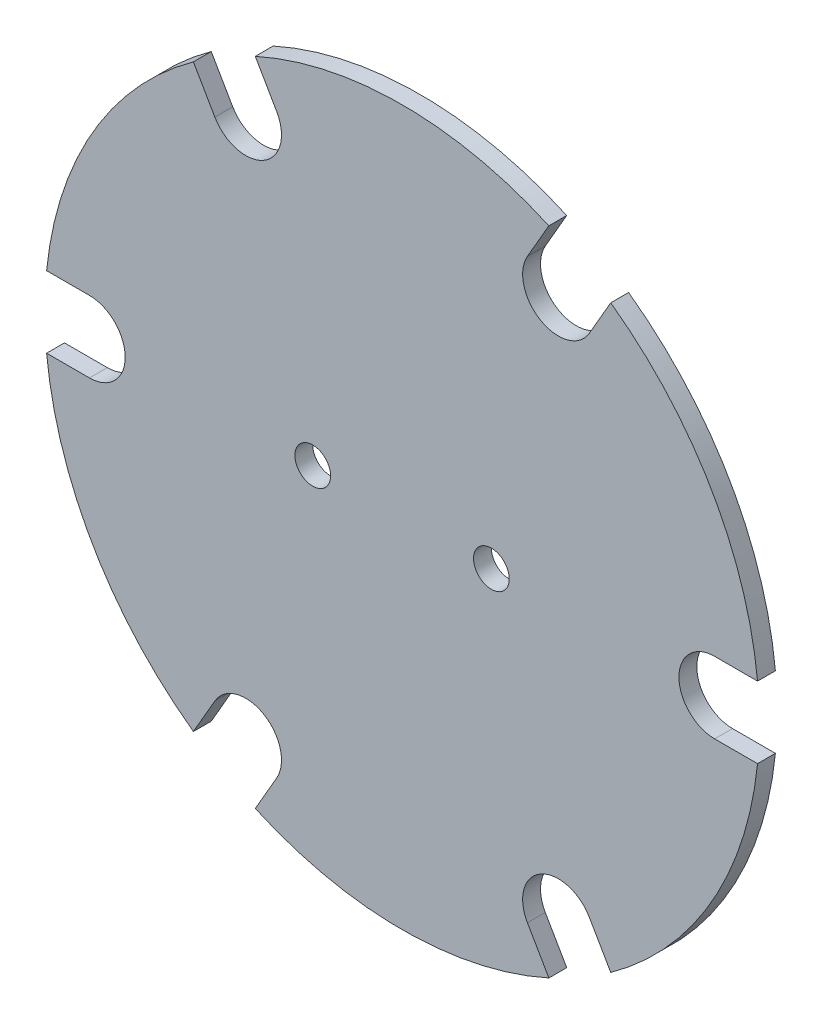
ISO-10303-21;
HEADER;
FILE_DESCRIPTION(('STEP AP214'),'2;1');
FILE_NAME('part.step','',(''),(''),'','','');
FILE_SCHEMA(('AUTOMOTIVE_DESIGN { 1 0 10303 214 1 1 1 1 }'));
ENDSEC;
DATA;
#1=APPLICATION_CONTEXT('core data for automotive mechanical design processes');
#2=APPLICATION_PROTOCOL_DEFINITION('international standard','automotive_design',2000,#1);
#3=PRODUCT_CONTEXT('',#1,'mechanical');
#4=PRODUCT('Part','Part','',(#3));
#5=PRODUCT_RELATED_PRODUCT_CATEGORY('part','',(#4));
#6=PRODUCT_DEFINITION_FORMATION('','',#4);
#7=PRODUCT_DEFINITION_CONTEXT('part definition',#1,'design');
#8=PRODUCT_DEFINITION('design','',#6,#7);
#9=PRODUCT_DEFINITION_SHAPE('','',#8);
#10=(LENGTH_UNIT() NAMED_UNIT(*) SI_UNIT(.MILLI.,.METRE.));
#11=(NAMED_UNIT(*) PLANE_ANGLE_UNIT() SI_UNIT($,.RADIAN.));
#12=(NAMED_UNIT(*) SI_UNIT($,.STERADIAN.) SOLID_ANGLE_UNIT());
#13=UNCERTAINTY_MEASURE_WITH_UNIT(LENGTH_MEASURE(1.E-05),#10,'distance_accuracy_value','');
#14=(GEOMETRIC_REPRESENTATION_CONTEXT(3) GLOBAL_UNCERTAINTY_ASSIGNED_CONTEXT((#13)) GLOBAL_UNIT_ASSIGNED_CONTEXT((#10,
#11,#12)) REPRESENTATION_CONTEXT('',''));
#15=CARTESIAN_POINT('',(0.,0.,0.));
#16=DIRECTION('',(0.,0.,1.));
#17=DIRECTION('',(1.,0.,0.));
#18=AXIS2_PLACEMENT_3D('',#15,#16,#17);
#19=CARTESIAN_POINT('',(-35.,0.,2.));
#20=DIRECTION('',(0.,0.,1.));
#21=DIRECTION('',(1.,0.,0.));
#22=AXIS2_PLACEMENT_3D('',#19,#20,#21);
#23=PLANE('',#22);
#24=CARTESIAN_POINT('',(-10.,0.,2.));
#25=DIRECTION('',(0.,0.,1.));
#26=DIRECTION('',(1.,0.,0.));
#27=AXIS2_PLACEMENT_3D('',#24,#25,#26);
#28=CIRCLE('',#27,2.);
#29=CARTESIAN_POINT('',(-8.,0.,2.));
#30=VERTEX_POINT('',#29);
#31=EDGE_CURVE('E230',#30,#30,#28,.T.);
#32=ORIENTED_EDGE('',*,*,#31,.F.);
#33=EDGE_LOOP('',(#32));
#34=FACE_BOUND('',#33,.T.);
#35=CARTESIAN_POINT('',(-35.,0.,2.));
#36=DIRECTION('',(0.,0.,-1.));
#37=DIRECTION('',(1.,0.,0.));
#38=AXIS2_PLACEMENT_3D('',#35,#36,#37);
#39=CIRCLE('',#38,4.);
#40=CARTESIAN_POINT('',(-35.,4.,2.));
#41=VERTEX_POINT('',#40);
#42=CARTESIAN_POINT('',(-35.,-4.,2.));
#43=VERTEX_POINT('',#42);
#44=EDGE_CURVE('E273',#41,#43,#39,.T.);
#45=ORIENTED_EDGE('',*,*,#44,.T.);
#46=DIRECTION('',(-1.,0.,0.));
#47=VECTOR('',#46,1.);
#48=CARTESIAN_POINT('',(-35.,-4.,2.));
#49=LINE('',#48,#47);
#50=CARTESIAN_POINT('',(-39.7994974842648,-3.99999999999999,2.));
#51=VERTEX_POINT('',#50);
#52=EDGE_CURVE('E141',#43,#51,#49,.T.);
#53=ORIENTED_EDGE('',*,*,#52,.T.);
#54=CARTESIAN_POINT('',(0.,0.,2.));
#55=DIRECTION('',(0.,0.,1.));
#56=DIRECTION('',(1.,0.,0.));
#57=AXIS2_PLACEMENT_3D('',#54,#55,#56);
#58=CIRCLE('',#57,40.);
#59=CARTESIAN_POINT('',(-23.3638503572701,-32.4673758792282,2.));
#60=VERTEX_POINT('',#59);
#61=EDGE_CURVE('E336',#51,#60,#58,.T.);
#62=ORIENTED_EDGE('',*,*,#61,.T.);
#63=DIRECTION('',(0.500000000000002,0.866025403784437,0.));
#64=VECTOR('',#63,1.);
#65=CARTESIAN_POINT('',(-20.9641016151377,-28.3108891324554,2.));
#66=LINE('',#65,#64);
#67=CARTESIAN_POINT('',(-20.9641016151377,-28.3108891324554,2.));
#68=VERTEX_POINT('',#67);
#69=EDGE_CURVE('E355',#60,#68,#66,.T.);
#70=ORIENTED_EDGE('',*,*,#69,.T.);
#71=CARTESIAN_POINT('',(-17.5,-30.3108891324554,2.));
#72=DIRECTION('',(0.,0.,-1.));
#73=DIRECTION('',(1.,0.,0.));
#74=AXIS2_PLACEMENT_3D('',#71,#72,#73);
#75=CIRCLE('',#74,4.);
#76=CARTESIAN_POINT('',(-14.0358983848622,-32.3108891324554,2.));
#77=VERTEX_POINT('',#76);
#78=EDGE_CURVE('E352',#68,#77,#75,.T.);
#79=ORIENTED_EDGE('',*,*,#78,.T.);
#80=DIRECTION('',(-0.499999999999999,-0.866025403784439,0.));
#81=VECTOR('',#80,1.);
#82=CARTESIAN_POINT('',(-14.0358983848622,-32.3108891324554,2.));
#83=LINE('',#82,#81);
#84=CARTESIAN_POINT('',(-16.4356471269946,-36.4673758792282,2.));
#85=VERTEX_POINT('',#84);
#86=EDGE_CURVE('E354',#77,#85,#83,.T.);
#87=ORIENTED_EDGE('',*,*,#86,.T.);
#88=CARTESIAN_POINT('',(0.,0.,2.));
#89=DIRECTION('',(0.,0.,1.));
#90=DIRECTION('',(1.,0.,0.));
#91=AXIS2_PLACEMENT_3D('',#88,#89,#90);
#92=CIRCLE('',#91,40.);
#93=CARTESIAN_POINT('',(16.4356471269947,-36.4673758792282,2.));
#94=VERTEX_POINT('',#93);
#95=EDGE_CURVE('E357',#85,#94,#92,.T.);
#96=ORIENTED_EDGE('',*,*,#95,.T.);
#97=DIRECTION('',(-0.499999999999999,0.866025403784439,0.));
#98=VECTOR('',#97,1.);
#99=CARTESIAN_POINT('',(14.0358983848623,-32.3108891324554,2.));
#100=LINE('',#99,#98);
#101=CARTESIAN_POINT('',(14.0358983848623,-32.3108891324554,2.));
#102=VERTEX_POINT('',#101);
#103=EDGE_CURVE('E363',#94,#102,#100,.T.);
#104=ORIENTED_EDGE('',*,*,#103,.T.);
#105=CARTESIAN_POINT('',(17.5,-30.3108891324554,2.));
#106=DIRECTION('',(0.,0.,-1.));
#107=DIRECTION('',(1.,0.,0.));
#108=AXIS2_PLACEMENT_3D('',#105,#106,#107);
#109=CIRCLE('',#108,4.);
#110=CARTESIAN_POINT('',(20.9641016151378,-28.3108891324553,2.));
#111=VERTEX_POINT('',#110);
#112=EDGE_CURVE('E365',#102,#111,#109,.T.);
#113=ORIENTED_EDGE('',*,*,#112,.T.);
#114=DIRECTION('',(0.5,-0.866025403784439,0.));
#115=VECTOR('',#114,1.);
#116=CARTESIAN_POINT('',(20.9641016151378,-28.3108891324553,2.));
#117=LINE('',#116,#115);
#118=CARTESIAN_POINT('',(23.3638503572702,-32.4673758792282,2.));
#119=VERTEX_POINT('',#118);
#120=EDGE_CURVE('E367',#111,#119,#117,.T.);
#121=ORIENTED_EDGE('',*,*,#120,.T.);
#122=CARTESIAN_POINT('',(0.,0.,2.));
#123=DIRECTION('',(0.,0.,1.));
#124=DIRECTION('',(1.,0.,0.));
#125=AXIS2_PLACEMENT_3D('',#122,#123,#124);
#126=CIRCLE('',#125,40.);
#127=CARTESIAN_POINT('',(39.7994974842648,-4.,2.));
#128=VERTEX_POINT('',#127);
#129=EDGE_CURVE('E369',#119,#128,#126,.T.);
#130=ORIENTED_EDGE('',*,*,#129,.T.);
#131=DIRECTION('',(-1.,0.,0.));
#132=VECTOR('',#131,1.);
#133=CARTESIAN_POINT('',(35.,-4.,2.));
#134=LINE('',#133,#132);
#135=CARTESIAN_POINT('',(35.,-4.,2.));
#136=VERTEX_POINT('',#135);
#137=EDGE_CURVE('E371',#128,#136,#134,.T.);
#138=ORIENTED_EDGE('',*,*,#137,.T.);
#139=CARTESIAN_POINT('',(35.,0.,2.));
#140=DIRECTION('',(0.,0.,-1.));
#141=DIRECTION('',(1.,0.,0.));
#142=AXIS2_PLACEMENT_3D('',#139,#140,#141);
#143=CIRCLE('',#142,4.);
#144=CARTESIAN_POINT('',(35.,4.,2.));
#145=VERTEX_POINT('',#144);
#146=EDGE_CURVE('E373',#136,#145,#143,.T.);
#147=ORIENTED_EDGE('',*,*,#146,.T.);
#148=DIRECTION('',(1.,0.,0.));
#149=VECTOR('',#148,1.);
#150=CARTESIAN_POINT('',(35.,4.,2.));
#151=LINE('',#150,#149);
#152=CARTESIAN_POINT('',(39.7994974842648,4.00000000000001,2.));
#153=VERTEX_POINT('',#152);
#154=EDGE_CURVE('E375',#145,#153,#151,.T.);
#155=ORIENTED_EDGE('',*,*,#154,.T.);
#156=CARTESIAN_POINT('',(0.,0.,2.));
#157=DIRECTION('',(0.,0.,1.));
#158=DIRECTION('',(1.,0.,0.));
#159=AXIS2_PLACEMENT_3D('',#156,#157,#158);
#160=CIRCLE('',#159,40.);
#161=CARTESIAN_POINT('',(23.3638503572701,32.4673758792282,2.));
#162=VERTEX_POINT('',#161);
#163=EDGE_CURVE('E377',#153,#162,#160,.T.);
#164=ORIENTED_EDGE('',*,*,#163,.T.);
#165=DIRECTION('',(-0.5,-0.866025403784439,0.));
#166=VECTOR('',#165,1.);
#167=CARTESIAN_POINT('',(20.9641016151378,28.3108891324554,2.));
#168=LINE('',#167,#166);
#169=CARTESIAN_POINT('',(20.9641016151378,28.3108891324554,2.));
#170=VERTEX_POINT('',#169);
#171=EDGE_CURVE('E379',#162,#170,#168,.T.);
#172=ORIENTED_EDGE('',*,*,#171,.T.);
#173=CARTESIAN_POINT('',(17.5,30.3108891324554,2.));
#174=DIRECTION('',(0.,0.,-1.));
#175=DIRECTION('',(1.,0.,0.));
#176=AXIS2_PLACEMENT_3D('',#173,#174,#175);
#177=CIRCLE('',#176,4.);
#178=CARTESIAN_POINT('',(14.0358983848622,32.3108891324554,2.));
#179=VERTEX_POINT('',#178);
#180=EDGE_CURVE('E381',#170,#179,#177,.T.);
#181=ORIENTED_EDGE('',*,*,#180,.T.);
#182=DIRECTION('',(0.499999999999999,0.866025403784439,0.));
#183=VECTOR('',#182,1.);
#184=CARTESIAN_POINT('',(14.0358983848622,32.3108891324554,2.));
#185=LINE('',#184,#183);
#186=CARTESIAN_POINT('',(16.4356471269946,36.4673758792282,2.));
#187=VERTEX_POINT('',#186);
#188=EDGE_CURVE('E383',#179,#187,#185,.T.);
#189=ORIENTED_EDGE('',*,*,#188,.T.);
#190=CARTESIAN_POINT('',(0.,0.,2.));
#191=DIRECTION('',(0.,0.,1.));
#192=DIRECTION('',(1.,0.,0.));
#193=AXIS2_PLACEMENT_3D('',#190,#191,#192);
#194=CIRCLE('',#193,40.);
#195=CARTESIAN_POINT('',(-16.4356471269946,36.4673758792282,2.));
#196=VERTEX_POINT('',#195);
#197=EDGE_CURVE('E385',#187,#196,#194,.T.);
#198=ORIENTED_EDGE('',*,*,#197,.T.);
#199=DIRECTION('',(0.5,-0.866025403784439,0.));
#200=VECTOR('',#199,1.);
#201=CARTESIAN_POINT('',(-14.0358983848623,32.3108891324554,2.));
#202=LINE('',#201,#200);
#203=CARTESIAN_POINT('',(-14.0358983848623,32.3108891324554,2.));
#204=VERTEX_POINT('',#203);
#205=EDGE_CURVE('E387',#196,#204,#202,.T.);
#206=ORIENTED_EDGE('',*,*,#205,.T.);
#207=CARTESIAN_POINT('',(-17.5,30.3108891324554,2.));
#208=DIRECTION('',(0.,0.,-1.));
#209=DIRECTION('',(1.,0.,0.));
#210=AXIS2_PLACEMENT_3D('',#207,#208,#209);
#211=CIRCLE('',#210,4.);
#212=CARTESIAN_POINT('',(-20.9641016151378,28.3108891324554,2.));
#213=VERTEX_POINT('',#212);
#214=EDGE_CURVE('E208',#204,#213,#211,.T.);
#215=ORIENTED_EDGE('',*,*,#214,.T.);
#216=DIRECTION('',(-0.5,0.866025403784438,0.));
#217=VECTOR('',#216,1.);
#218=CARTESIAN_POINT('',(-20.9641016151378,28.3108891324554,2.));
#219=LINE('',#218,#217);
#220=CARTESIAN_POINT('',(-23.3638503572702,32.4673758792282,2.));
#221=VERTEX_POINT('',#220);
#222=EDGE_CURVE('E202',#213,#221,#219,.T.);
#223=ORIENTED_EDGE('',*,*,#222,.T.);
#224=CARTESIAN_POINT('',(0.,0.,2.));
#225=DIRECTION('',(0.,0.,1.));
#226=DIRECTION('',(1.,0.,0.));
#227=AXIS2_PLACEMENT_3D('',#224,#225,#226);
#228=CIRCLE('',#227,40.);
#229=CARTESIAN_POINT('',(-39.7994974842648,4.,2.));
#230=VERTEX_POINT('',#229);
#231=EDGE_CURVE('E206',#221,#230,#228,.T.);
#232=ORIENTED_EDGE('',*,*,#231,.T.);
#233=DIRECTION('',(1.,0.,0.));
#234=VECTOR('',#233,1.);
#235=CARTESIAN_POINT('',(-35.,4.,2.));
#236=LINE('',#235,#234);
#237=EDGE_CURVE('E50',#230,#41,#236,.T.);
#238=ORIENTED_EDGE('',*,*,#237,.T.);
#239=EDGE_LOOP('',(#45,#53,#62,#70,#79,#87,#96,#104,#113,#121,#130,#138,#147,#155,#164,#172,
#181,#189,#198,#206,#215,#223,#232,#238));
#240=FACE_BOUND('',#239,.T.);
#241=CARTESIAN_POINT('',(10.,0.,2.));
#242=DIRECTION('',(0.,0.,1.));
#243=DIRECTION('',(1.,0.,0.));
#244=AXIS2_PLACEMENT_3D('',#241,#242,#243);
#245=CIRCLE('',#244,2.);
#246=CARTESIAN_POINT('',(12.,0.,2.));
#247=VERTEX_POINT('',#246);
#248=EDGE_CURVE('E429',#247,#247,#245,.T.);
#249=ORIENTED_EDGE('',*,*,#248,.F.);
#250=EDGE_LOOP('',(#249));
#251=FACE_BOUND('',#250,.T.);
#252=ADVANCED_FACE('F33',(#34,#240,#251),#23,.T.);
#253=CARTESIAN_POINT('',(-35.,0.,0.));
#254=DIRECTION('',(0.,0.,1.));
#255=DIRECTION('',(1.,0.,0.));
#256=AXIS2_PLACEMENT_3D('',#253,#254,#255);
#257=PLANE('',#256);
#258=CARTESIAN_POINT('',(-35.,0.,0.));
#259=DIRECTION('',(0.,0.,-1.));
#260=DIRECTION('',(1.,0.,0.));
#261=AXIS2_PLACEMENT_3D('',#258,#259,#260);
#262=CIRCLE('',#261,4.);
#263=CARTESIAN_POINT('',(-35.,4.,0.));
#264=VERTEX_POINT('',#263);
#265=CARTESIAN_POINT('',(-35.,-4.,0.));
#266=VERTEX_POINT('',#265);
#267=EDGE_CURVE('E226',#264,#266,#262,.T.);
#268=ORIENTED_EDGE('',*,*,#267,.F.);
#269=DIRECTION('',(1.,0.,0.));
#270=VECTOR('',#269,1.);
#271=CARTESIAN_POINT('',(-35.,4.,0.));
#272=LINE('',#271,#270);
#273=CARTESIAN_POINT('',(-39.7994974842648,4.,0.));
#274=VERTEX_POINT('',#273);
#275=EDGE_CURVE('E133',#274,#264,#272,.T.);
#276=ORIENTED_EDGE('',*,*,#275,.F.);
#277=CARTESIAN_POINT('',(0.,0.,0.));
#278=DIRECTION('',(0.,0.,1.));
#279=DIRECTION('',(1.,0.,0.));
#280=AXIS2_PLACEMENT_3D('',#277,#278,#279);
#281=CIRCLE('',#280,40.);
#282=CARTESIAN_POINT('',(-23.3638503572702,32.4673758792282,0.));
#283=VERTEX_POINT('',#282);
#284=EDGE_CURVE('E127',#283,#274,#281,.T.);
#285=ORIENTED_EDGE('',*,*,#284,.F.);
#286=DIRECTION('',(-0.5,0.866025403784438,0.));
#287=VECTOR('',#286,1.);
#288=CARTESIAN_POINT('',(-20.9641016151378,28.3108891324554,0.));
#289=LINE('',#288,#287);
#290=CARTESIAN_POINT('',(-20.9641016151378,28.3108891324554,0.));
#291=VERTEX_POINT('',#290);
#292=EDGE_CURVE('E216',#291,#283,#289,.T.);
#293=ORIENTED_EDGE('',*,*,#292,.F.);
#294=CARTESIAN_POINT('',(-17.5,30.3108891324554,0.));
#295=DIRECTION('',(0.,0.,-1.));
#296=DIRECTION('',(1.,0.,0.));
#297=AXIS2_PLACEMENT_3D('',#294,#295,#296);
#298=CIRCLE('',#297,4.);
#299=CARTESIAN_POINT('',(-14.0358983848623,32.3108891324554,0.));
#300=VERTEX_POINT('',#299);
#301=EDGE_CURVE('E268',#300,#291,#298,.T.);
#302=ORIENTED_EDGE('',*,*,#301,.F.);
#303=DIRECTION('',(0.5,-0.866025403784439,0.));
#304=VECTOR('',#303,1.);
#305=CARTESIAN_POINT('',(-14.0358983848623,32.3108891324554,0.));
#306=LINE('',#305,#304);
#307=CARTESIAN_POINT('',(-16.4356471269946,36.4673758792282,0.));
#308=VERTEX_POINT('',#307);
#309=EDGE_CURVE('E266',#308,#300,#306,.T.);
#310=ORIENTED_EDGE('',*,*,#309,.F.);
#311=CARTESIAN_POINT('',(0.,0.,0.));
#312=DIRECTION('',(0.,0.,1.));
#313=DIRECTION('',(1.,0.,0.));
#314=AXIS2_PLACEMENT_3D('',#311,#312,#313);
#315=CIRCLE('',#314,40.);
#316=CARTESIAN_POINT('',(16.4356471269946,36.4673758792282,0.));
#317=VERTEX_POINT('',#316);
#318=EDGE_CURVE('E264',#317,#308,#315,.T.);
#319=ORIENTED_EDGE('',*,*,#318,.F.);
#320=DIRECTION('',(0.499999999999999,0.866025403784439,0.));
#321=VECTOR('',#320,1.);
#322=CARTESIAN_POINT('',(14.0358983848622,32.3108891324554,0.));
#323=LINE('',#322,#321);
#324=CARTESIAN_POINT('',(14.0358983848622,32.3108891324554,0.));
#325=VERTEX_POINT('',#324);
#326=EDGE_CURVE('E262',#325,#317,#323,.T.);
#327=ORIENTED_EDGE('',*,*,#326,.F.);
#328=CARTESIAN_POINT('',(17.5,30.3108891324554,0.));
#329=DIRECTION('',(0.,0.,-1.));
#330=DIRECTION('',(1.,0.,0.));
#331=AXIS2_PLACEMENT_3D('',#328,#329,#330);
#332=CIRCLE('',#331,4.);
#333=CARTESIAN_POINT('',(20.9641016151378,28.3108891324554,0.));
#334=VERTEX_POINT('',#333);
#335=EDGE_CURVE('E260',#334,#325,#332,.T.);
#336=ORIENTED_EDGE('',*,*,#335,.F.);
#337=DIRECTION('',(-0.5,-0.866025403784439,0.));
#338=VECTOR('',#337,1.);
#339=CARTESIAN_POINT('',(20.9641016151378,28.3108891324554,0.));
#340=LINE('',#339,#338);
#341=CARTESIAN_POINT('',(23.3638503572701,32.4673758792282,0.));
#342=VERTEX_POINT('',#341);
#343=EDGE_CURVE('E258',#342,#334,#340,.T.);
#344=ORIENTED_EDGE('',*,*,#343,.F.);
#345=CARTESIAN_POINT('',(0.,0.,0.));
#346=DIRECTION('',(0.,0.,1.));
#347=DIRECTION('',(1.,0.,0.));
#348=AXIS2_PLACEMENT_3D('',#345,#346,#347);
#349=CIRCLE('',#348,40.);
#350=CARTESIAN_POINT('',(39.7994974842648,4.00000000000001,0.));
#351=VERTEX_POINT('',#350);
#352=EDGE_CURVE('E256',#351,#342,#349,.T.);
#353=ORIENTED_EDGE('',*,*,#352,.F.);
#354=DIRECTION('',(1.,0.,0.));
#355=VECTOR('',#354,1.);
#356=CARTESIAN_POINT('',(35.,4.,0.));
#357=LINE('',#356,#355);
#358=CARTESIAN_POINT('',(35.,4.,0.));
#359=VERTEX_POINT('',#358);
#360=EDGE_CURVE('E254',#359,#351,#357,.T.);
#361=ORIENTED_EDGE('',*,*,#360,.F.);
#362=CARTESIAN_POINT('',(35.,0.,0.));
#363=DIRECTION('',(0.,0.,-1.));
#364=DIRECTION('',(1.,0.,0.));
#365=AXIS2_PLACEMENT_3D('',#362,#363,#364);
#366=CIRCLE('',#365,4.);
#367=CARTESIAN_POINT('',(35.,-4.,0.));
#368=VERTEX_POINT('',#367);
#369=EDGE_CURVE('E252',#368,#359,#366,.T.);
#370=ORIENTED_EDGE('',*,*,#369,.F.);
#371=DIRECTION('',(-1.,0.,0.));
#372=VECTOR('',#371,1.);
#373=CARTESIAN_POINT('',(35.,-4.,0.));
#374=LINE('',#373,#372);
#375=CARTESIAN_POINT('',(39.7994974842648,-4.,0.));
#376=VERTEX_POINT('',#375);
#377=EDGE_CURVE('E250',#376,#368,#374,.T.);
#378=ORIENTED_EDGE('',*,*,#377,.F.);
#379=CARTESIAN_POINT('',(0.,0.,0.));
#380=DIRECTION('',(0.,0.,1.));
#381=DIRECTION('',(1.,0.,0.));
#382=AXIS2_PLACEMENT_3D('',#379,#380,#381);
#383=CIRCLE('',#382,40.);
#384=CARTESIAN_POINT('',(23.3638503572702,-32.4673758792282,0.));
#385=VERTEX_POINT('',#384);
#386=EDGE_CURVE('E248',#385,#376,#383,.T.);
#387=ORIENTED_EDGE('',*,*,#386,.F.);
#388=DIRECTION('',(0.5,-0.866025403784439,0.));
#389=VECTOR('',#388,1.);
#390=CARTESIAN_POINT('',(20.9641016151378,-28.3108891324553,0.));
#391=LINE('',#390,#389);
#392=CARTESIAN_POINT('',(20.9641016151378,-28.3108891324553,0.));
#393=VERTEX_POINT('',#392);
#394=EDGE_CURVE('E246',#393,#385,#391,.T.);
#395=ORIENTED_EDGE('',*,*,#394,.F.);
#396=CARTESIAN_POINT('',(17.5,-30.3108891324554,0.));
#397=DIRECTION('',(0.,0.,-1.));
#398=DIRECTION('',(1.,0.,0.));
#399=AXIS2_PLACEMENT_3D('',#396,#397,#398);
#400=CIRCLE('',#399,4.);
#401=CARTESIAN_POINT('',(14.0358983848623,-32.3108891324554,0.));
#402=VERTEX_POINT('',#401);
#403=EDGE_CURVE('E244',#402,#393,#400,.T.);
#404=ORIENTED_EDGE('',*,*,#403,.F.);
#405=DIRECTION('',(-0.499999999999999,0.866025403784439,0.));
#406=VECTOR('',#405,1.);
#407=CARTESIAN_POINT('',(14.0358983848623,-32.3108891324554,0.));
#408=LINE('',#407,#406);
#409=CARTESIAN_POINT('',(16.4356471269947,-36.4673758792282,0.));
#410=VERTEX_POINT('',#409);
#411=EDGE_CURVE('E242',#410,#402,#408,.T.);
#412=ORIENTED_EDGE('',*,*,#411,.F.);
#413=CARTESIAN_POINT('',(0.,0.,0.));
#414=DIRECTION('',(0.,0.,1.));
#415=DIRECTION('',(1.,0.,0.));
#416=AXIS2_PLACEMENT_3D('',#413,#414,#415);
#417=CIRCLE('',#416,40.);
#418=CARTESIAN_POINT('',(-16.4356471269946,-36.4673758792282,0.));
#419=VERTEX_POINT('',#418);
#420=EDGE_CURVE('E240',#419,#410,#417,.T.);
#421=ORIENTED_EDGE('',*,*,#420,.F.);
#422=DIRECTION('',(-0.499999999999999,-0.866025403784439,0.));
#423=VECTOR('',#422,1.);
#424=CARTESIAN_POINT('',(-14.0358983848622,-32.3108891324554,0.));
#425=LINE('',#424,#423);
#426=CARTESIAN_POINT('',(-14.0358983848622,-32.3108891324554,0.));
#427=VERTEX_POINT('',#426);
#428=EDGE_CURVE('E238',#427,#419,#425,.T.);
#429=ORIENTED_EDGE('',*,*,#428,.F.);
#430=CARTESIAN_POINT('',(-17.5,-30.3108891324554,0.));
#431=DIRECTION('',(0.,0.,-1.));
#432=DIRECTION('',(1.,0.,0.));
#433=AXIS2_PLACEMENT_3D('',#430,#431,#432);
#434=CIRCLE('',#433,4.);
#435=CARTESIAN_POINT('',(-20.9641016151377,-28.3108891324554,0.));
#436=VERTEX_POINT('',#435);
#437=EDGE_CURVE('E236',#436,#427,#434,.T.);
#438=ORIENTED_EDGE('',*,*,#437,.F.);
#439=DIRECTION('',(0.500000000000002,0.866025403784437,0.));
#440=VECTOR('',#439,1.);
#441=CARTESIAN_POINT('',(-20.9641016151377,-28.3108891324554,0.));
#442=LINE('',#441,#440);
#443=CARTESIAN_POINT('',(-23.3638503572701,-32.4673758792282,0.));
#444=VERTEX_POINT('',#443);
#445=EDGE_CURVE('E234',#444,#436,#442,.T.);
#446=ORIENTED_EDGE('',*,*,#445,.F.);
#447=CARTESIAN_POINT('',(0.,0.,0.));
#448=DIRECTION('',(0.,0.,1.));
#449=DIRECTION('',(1.,0.,0.));
#450=AXIS2_PLACEMENT_3D('',#447,#448,#449);
#451=CIRCLE('',#450,40.);
#452=CARTESIAN_POINT('',(-39.7994974842648,-3.99999999999999,0.));
#453=VERTEX_POINT('',#452);
#454=EDGE_CURVE('E232',#453,#444,#451,.T.);
#455=ORIENTED_EDGE('',*,*,#454,.F.);
#456=DIRECTION('',(-1.,0.,0.));
#457=VECTOR('',#456,1.);
#458=CARTESIAN_POINT('',(-35.,-4.,0.));
#459=LINE('',#458,#457);
#460=EDGE_CURVE('E229',#266,#453,#459,.T.);
#461=ORIENTED_EDGE('',*,*,#460,.F.);
#462=EDGE_LOOP('',(#268,#276,#285,#293,#302,#310,#319,#327,#336,#344,#353,#361,#370,#378,#387,
#395,#404,#412,#421,#429,#438,#446,#455,#461));
#463=FACE_BOUND('',#462,.T.);
#464=CARTESIAN_POINT('',(-10.,0.,0.));
#465=DIRECTION('',(0.,0.,1.));
#466=DIRECTION('',(1.,0.,0.));
#467=AXIS2_PLACEMENT_3D('',#464,#465,#466);
#468=CIRCLE('',#467,2.);
#469=CARTESIAN_POINT('',(-8.,0.,0.));
#470=VERTEX_POINT('',#469);
#471=EDGE_CURVE('E435',#470,#470,#468,.T.);
#472=ORIENTED_EDGE('',*,*,#471,.T.);
#473=EDGE_LOOP('',(#472));
#474=FACE_BOUND('',#473,.T.);
#475=CARTESIAN_POINT('',(10.,0.,0.));
#476=DIRECTION('',(0.,0.,1.));
#477=DIRECTION('',(1.,0.,0.));
#478=AXIS2_PLACEMENT_3D('',#475,#476,#477);
#479=CIRCLE('',#478,2.);
#480=CARTESIAN_POINT('',(12.,0.,0.));
#481=VERTEX_POINT('',#480);
#482=EDGE_CURVE('E432',#481,#481,#479,.T.);
#483=ORIENTED_EDGE('',*,*,#482,.T.);
#484=EDGE_LOOP('',(#483));
#485=FACE_BOUND('',#484,.T.);
#486=ADVANCED_FACE('F340',(#463,#474,#485),#257,.F.);
#487=CARTESIAN_POINT('',(-35.,0.,2.));
#488=DIRECTION('',(0.,0.,-1.));
#489=DIRECTION('',(-1.,0.,0.));
#490=AXIS2_PLACEMENT_3D('',#487,#488,#489);
#491=CYLINDRICAL_SURFACE('',#490,4.);
#492=ORIENTED_EDGE('',*,*,#267,.T.);
#493=DIRECTION('',(0.,0.,-1.));
#494=VECTOR('',#493,1.);
#495=CARTESIAN_POINT('',(-35.,-4.,2.));
#496=LINE('',#495,#494);
#497=EDGE_CURVE('E11',#43,#266,#496,.T.);
#498=ORIENTED_EDGE('',*,*,#497,.F.);
#499=ORIENTED_EDGE('',*,*,#44,.F.);
#500=DIRECTION('',(0.,0.,-1.));
#501=VECTOR('',#500,1.);
#502=CARTESIAN_POINT('',(-35.,4.,2.));
#503=LINE('',#502,#501);
#504=EDGE_CURVE('E222',#41,#264,#503,.T.);
#505=ORIENTED_EDGE('',*,*,#504,.T.);
#506=EDGE_LOOP('',(#492,#498,#499,#505));
#507=FACE_BOUND('',#506,.T.);
#508=ADVANCED_FACE('F35',(#507),#491,.F.);
#509=CARTESIAN_POINT('',(-35.,-4.,2.));
#510=DIRECTION('',(0.,-1.,0.));
#511=DIRECTION('',(0.,0.,-1.));
#512=AXIS2_PLACEMENT_3D('',#509,#510,#511);
#513=PLANE('',#512);
#514=ORIENTED_EDGE('',*,*,#460,.T.);
#515=DIRECTION('',(0.,0.,-1.));
#516=VECTOR('',#515,1.);
#517=CARTESIAN_POINT('',(-39.7994974842648,-3.99999999999999,2.));
#518=LINE('',#517,#516);
#519=EDGE_CURVE('E42',#51,#453,#518,.T.);
#520=ORIENTED_EDGE('',*,*,#519,.F.);
#521=ORIENTED_EDGE('',*,*,#52,.F.);
#522=ORIENTED_EDGE('',*,*,#497,.T.);
#523=EDGE_LOOP('',(#514,#520,#521,#522));
#524=FACE_BOUND('',#523,.T.);
#525=ADVANCED_FACE('F648',(#524),#513,.F.);
#526=CARTESIAN_POINT('',(0.,0.,2.));
#527=DIRECTION('',(0.,0.,-1.));
#528=DIRECTION('',(-1.,0.,0.));
#529=AXIS2_PLACEMENT_3D('',#526,#527,#528);
#530=CYLINDRICAL_SURFACE('',#529,40.);
#531=ORIENTED_EDGE('',*,*,#454,.T.);
#532=DIRECTION('',(0.,0.,-1.));
#533=VECTOR('',#532,1.);
#534=CARTESIAN_POINT('',(-23.3638503572701,-32.4673758792282,2.));
#535=LINE('',#534,#533);
#536=EDGE_CURVE('E328',#60,#444,#535,.T.);
#537=ORIENTED_EDGE('',*,*,#536,.F.);
#538=ORIENTED_EDGE('',*,*,#61,.F.);
#539=ORIENTED_EDGE('',*,*,#519,.T.);
#540=EDGE_LOOP('',(#531,#537,#538,#539));
#541=FACE_BOUND('',#540,.T.);
#542=ADVANCED_FACE('F334',(#541),#530,.T.);
#543=CARTESIAN_POINT('',(-20.9641016151377,-28.3108891324554,2.));
#544=DIRECTION('',(-0.866025403784437,0.500000000000002,0.));
#545=DIRECTION('',(-0.500000000000002,-0.866025403784437,0.));
#546=AXIS2_PLACEMENT_3D('',#543,#544,#545);
#547=PLANE('',#546);
#548=ORIENTED_EDGE('',*,*,#445,.T.);
#549=DIRECTION('',(0.,0.,-1.));
#550=VECTOR('',#549,1.);
#551=CARTESIAN_POINT('',(-20.9641016151377,-28.3108891324554,2.));
#552=LINE('',#551,#550);
#553=EDGE_CURVE('E325',#68,#436,#552,.T.);
#554=ORIENTED_EDGE('',*,*,#553,.F.);
#555=ORIENTED_EDGE('',*,*,#69,.F.);
#556=ORIENTED_EDGE('',*,*,#536,.T.);
#557=EDGE_LOOP('',(#548,#554,#555,#556));
#558=FACE_BOUND('',#557,.T.);
#559=ADVANCED_FACE('F346',(#558),#547,.F.);
#560=CARTESIAN_POINT('',(-17.5,-30.3108891324554,2.));
#561=DIRECTION('',(0.,0.,-1.));
#562=DIRECTION('',(-1.,0.,0.));
#563=AXIS2_PLACEMENT_3D('',#560,#561,#562);
#564=CYLINDRICAL_SURFACE('',#563,4.);
#565=ORIENTED_EDGE('',*,*,#437,.T.);
#566=DIRECTION('',(0.,0.,-1.));
#567=VECTOR('',#566,1.);
#568=CARTESIAN_POINT('',(-14.0358983848622,-32.3108891324554,2.));
#569=LINE('',#568,#567);
#570=EDGE_CURVE('E322',#77,#427,#569,.T.);
#571=ORIENTED_EDGE('',*,*,#570,.F.);
#572=ORIENTED_EDGE('',*,*,#78,.F.);
#573=ORIENTED_EDGE('',*,*,#553,.T.);
#574=EDGE_LOOP('',(#565,#571,#572,#573));
#575=FACE_BOUND('',#574,.T.);
#576=ADVANCED_FACE('F350',(#575),#564,.F.);
#577=CARTESIAN_POINT('',(-14.0358983848622,-32.3108891324554,2.));
#578=DIRECTION('',(0.866025403784439,-0.499999999999999,0.));
#579=DIRECTION('',(0.499999999999999,0.866025403784439,0.));
#580=AXIS2_PLACEMENT_3D('',#577,#578,#579);
#581=PLANE('',#580);
#582=ORIENTED_EDGE('',*,*,#428,.T.);
#583=DIRECTION('',(0.,0.,-1.));
#584=VECTOR('',#583,1.);
#585=CARTESIAN_POINT('',(-16.4356471269946,-36.4673758792282,2.));
#586=LINE('',#585,#584);
#587=EDGE_CURVE('E319',#85,#419,#586,.T.);
#588=ORIENTED_EDGE('',*,*,#587,.F.);
#589=ORIENTED_EDGE('',*,*,#86,.F.);
#590=ORIENTED_EDGE('',*,*,#570,.T.);
#591=EDGE_LOOP('',(#582,#588,#589,#590));
#592=FACE_BOUND('',#591,.T.);
#593=ADVANCED_FACE('F613',(#592),#581,.F.);
#594=CARTESIAN_POINT('',(0.,0.,2.));
#595=DIRECTION('',(0.,0.,-1.));
#596=DIRECTION('',(-1.,0.,0.));
#597=AXIS2_PLACEMENT_3D('',#594,#595,#596);
#598=CYLINDRICAL_SURFACE('',#597,40.);
#599=ORIENTED_EDGE('',*,*,#420,.T.);
#600=DIRECTION('',(0.,0.,-1.));
#601=VECTOR('',#600,1.);
#602=CARTESIAN_POINT('',(16.4356471269947,-36.4673758792282,2.));
#603=LINE('',#602,#601);
#604=EDGE_CURVE('E316',#94,#410,#603,.T.);
#605=ORIENTED_EDGE('',*,*,#604,.F.);
#606=ORIENTED_EDGE('',*,*,#95,.F.);
#607=ORIENTED_EDGE('',*,*,#587,.T.);
#608=EDGE_LOOP('',(#599,#605,#606,#607));
#609=FACE_BOUND('',#608,.T.);
#610=ADVANCED_FACE('F603',(#609),#598,.T.);
#611=CARTESIAN_POINT('',(14.0358983848623,-32.3108891324554,2.));
#612=DIRECTION('',(-0.866025403784439,-0.499999999999999,0.));
#613=DIRECTION('',(0.499999999999999,-0.866025403784439,0.));
#614=AXIS2_PLACEMENT_3D('',#611,#612,#613);
#615=PLANE('',#614);
#616=ORIENTED_EDGE('',*,*,#411,.T.);
#617=DIRECTION('',(0.,0.,-1.));
#618=VECTOR('',#617,1.);
#619=CARTESIAN_POINT('',(14.0358983848623,-32.3108891324554,2.));
#620=LINE('',#619,#618);
#621=EDGE_CURVE('E313',#102,#402,#620,.T.);
#622=ORIENTED_EDGE('',*,*,#621,.F.);
#623=ORIENTED_EDGE('',*,*,#103,.F.);
#624=ORIENTED_EDGE('',*,*,#604,.T.);
#625=EDGE_LOOP('',(#616,#622,#623,#624));
#626=FACE_BOUND('',#625,.T.);
#627=ADVANCED_FACE('F593',(#626),#615,.F.);
#628=CARTESIAN_POINT('',(17.5,-30.3108891324554,2.));
#629=DIRECTION('',(0.,0.,-1.));
#630=DIRECTION('',(-1.,0.,0.));
#631=AXIS2_PLACEMENT_3D('',#628,#629,#630);
#632=CYLINDRICAL_SURFACE('',#631,4.);
#633=ORIENTED_EDGE('',*,*,#403,.T.);
#634=DIRECTION('',(0.,0.,-1.));
#635=VECTOR('',#634,1.);
#636=CARTESIAN_POINT('',(20.9641016151378,-28.3108891324553,2.));
#637=LINE('',#636,#635);
#638=EDGE_CURVE('E310',#111,#393,#637,.T.);
#639=ORIENTED_EDGE('',*,*,#638,.F.);
#640=ORIENTED_EDGE('',*,*,#112,.F.);
#641=ORIENTED_EDGE('',*,*,#621,.T.);
#642=EDGE_LOOP('',(#633,#639,#640,#641));
#643=FACE_BOUND('',#642,.T.);
#644=ADVANCED_FACE('F583',(#643),#632,.F.);
#645=CARTESIAN_POINT('',(20.9641016151378,-28.3108891324553,2.));
#646=DIRECTION('',(0.866025403784439,0.5,0.));
#647=DIRECTION('',(-0.5,0.866025403784439,0.));
#648=AXIS2_PLACEMENT_3D('',#645,#646,#647);
#649=PLANE('',#648);
#650=ORIENTED_EDGE('',*,*,#394,.T.);
#651=DIRECTION('',(0.,0.,-1.));
#652=VECTOR('',#651,1.);
#653=CARTESIAN_POINT('',(23.3638503572702,-32.4673758792282,2.));
#654=LINE('',#653,#652);
#655=EDGE_CURVE('E307',#119,#385,#654,.T.);
#656=ORIENTED_EDGE('',*,*,#655,.F.);
#657=ORIENTED_EDGE('',*,*,#120,.F.);
#658=ORIENTED_EDGE('',*,*,#638,.T.);
#659=EDGE_LOOP('',(#650,#656,#657,#658));
#660=FACE_BOUND('',#659,.T.);
#661=ADVANCED_FACE('F573',(#660),#649,.F.);
#662=CARTESIAN_POINT('',(0.,0.,2.));
#663=DIRECTION('',(0.,0.,-1.));
#664=DIRECTION('',(-1.,0.,0.));
#665=AXIS2_PLACEMENT_3D('',#662,#663,#664);
#666=CYLINDRICAL_SURFACE('',#665,40.);
#667=ORIENTED_EDGE('',*,*,#386,.T.);
#668=DIRECTION('',(0.,0.,-1.));
#669=VECTOR('',#668,1.);
#670=CARTESIAN_POINT('',(39.7994974842648,-4.,2.));
#671=LINE('',#670,#669);
#672=EDGE_CURVE('E304',#128,#376,#671,.T.);
#673=ORIENTED_EDGE('',*,*,#672,.F.);
#674=ORIENTED_EDGE('',*,*,#129,.F.);
#675=ORIENTED_EDGE('',*,*,#655,.T.);
#676=EDGE_LOOP('',(#667,#673,#674,#675));
#677=FACE_BOUND('',#676,.T.);
#678=ADVANCED_FACE('F563',(#677),#666,.T.);
#679=CARTESIAN_POINT('',(35.,-4.,2.));
#680=DIRECTION('',(0.,-1.,0.));
#681=DIRECTION('',(0.,0.,-1.));
#682=AXIS2_PLACEMENT_3D('',#679,#680,#681);
#683=PLANE('',#682);
#684=ORIENTED_EDGE('',*,*,#377,.T.);
#685=DIRECTION('',(0.,0.,-1.));
#686=VECTOR('',#685,1.);
#687=CARTESIAN_POINT('',(35.,-4.,2.));
#688=LINE('',#687,#686);
#689=EDGE_CURVE('E301',#136,#368,#688,.T.);
#690=ORIENTED_EDGE('',*,*,#689,.F.);
#691=ORIENTED_EDGE('',*,*,#137,.F.);
#692=ORIENTED_EDGE('',*,*,#672,.T.);
#693=EDGE_LOOP('',(#684,#690,#691,#692));
#694=FACE_BOUND('',#693,.T.);
#695=ADVANCED_FACE('F553',(#694),#683,.F.);
#696=CARTESIAN_POINT('',(35.,0.,2.));
#697=DIRECTION('',(0.,0.,-1.));
#698=DIRECTION('',(-1.,0.,0.));
#699=AXIS2_PLACEMENT_3D('',#696,#697,#698);
#700=CYLINDRICAL_SURFACE('',#699,4.);
#701=ORIENTED_EDGE('',*,*,#369,.T.);
#702=DIRECTION('',(0.,0.,-1.));
#703=VECTOR('',#702,1.);
#704=CARTESIAN_POINT('',(35.,4.,2.));
#705=LINE('',#704,#703);
#706=EDGE_CURVE('E298',#145,#359,#705,.T.);
#707=ORIENTED_EDGE('',*,*,#706,.F.);
#708=ORIENTED_EDGE('',*,*,#146,.F.);
#709=ORIENTED_EDGE('',*,*,#689,.T.);
#710=EDGE_LOOP('',(#701,#707,#708,#709));
#711=FACE_BOUND('',#710,.T.);
#712=ADVANCED_FACE('F543',(#711),#700,.F.);
#713=CARTESIAN_POINT('',(35.,4.,2.));
#714=DIRECTION('',(0.,1.,0.));
#715=DIRECTION('',(-1.,0.,0.));
#716=AXIS2_PLACEMENT_3D('',#713,#714,#715);
#717=PLANE('',#716);
#718=ORIENTED_EDGE('',*,*,#360,.T.);
#719=DIRECTION('',(0.,0.,-1.));
#720=VECTOR('',#719,1.);
#721=CARTESIAN_POINT('',(39.7994974842648,4.00000000000001,2.));
#722=LINE('',#721,#720);
#723=EDGE_CURVE('E295',#153,#351,#722,.T.);
#724=ORIENTED_EDGE('',*,*,#723,.F.);
#725=ORIENTED_EDGE('',*,*,#154,.F.);
#726=ORIENTED_EDGE('',*,*,#706,.T.);
#727=EDGE_LOOP('',(#718,#724,#725,#726));
#728=FACE_BOUND('',#727,.T.);
#729=ADVANCED_FACE('F533',(#728),#717,.F.);
#730=CARTESIAN_POINT('',(0.,0.,2.));
#731=DIRECTION('',(0.,0.,-1.));
#732=DIRECTION('',(-1.,0.,0.));
#733=AXIS2_PLACEMENT_3D('',#730,#731,#732);
#734=CYLINDRICAL_SURFACE('',#733,40.);
#735=ORIENTED_EDGE('',*,*,#352,.T.);
#736=DIRECTION('',(0.,0.,-1.));
#737=VECTOR('',#736,1.);
#738=CARTESIAN_POINT('',(23.3638503572701,32.4673758792282,2.));
#739=LINE('',#738,#737);
#740=EDGE_CURVE('E292',#162,#342,#739,.T.);
#741=ORIENTED_EDGE('',*,*,#740,.F.);
#742=ORIENTED_EDGE('',*,*,#163,.F.);
#743=ORIENTED_EDGE('',*,*,#723,.T.);
#744=EDGE_LOOP('',(#735,#741,#742,#743));
#745=FACE_BOUND('',#744,.T.);
#746=ADVANCED_FACE('F523',(#745),#734,.T.);
#747=CARTESIAN_POINT('',(20.9641016151378,28.3108891324554,2.));
#748=DIRECTION('',(0.866025403784439,-0.499999999999999,0.));
#749=DIRECTION('',(0.5,0.866025403784439,0.));
#750=AXIS2_PLACEMENT_3D('',#747,#748,#749);
#751=PLANE('',#750);
#752=ORIENTED_EDGE('',*,*,#343,.T.);
#753=DIRECTION('',(0.,0.,-1.));
#754=VECTOR('',#753,1.);
#755=CARTESIAN_POINT('',(20.9641016151378,28.3108891324554,2.));
#756=LINE('',#755,#754);
#757=EDGE_CURVE('E289',#170,#334,#756,.T.);
#758=ORIENTED_EDGE('',*,*,#757,.F.);
#759=ORIENTED_EDGE('',*,*,#171,.F.);
#760=ORIENTED_EDGE('',*,*,#740,.T.);
#761=EDGE_LOOP('',(#752,#758,#759,#760));
#762=FACE_BOUND('',#761,.T.);
#763=ADVANCED_FACE('F513',(#762),#751,.F.);
#764=CARTESIAN_POINT('',(17.5,30.3108891324554,2.));
#765=DIRECTION('',(0.,0.,-1.));
#766=DIRECTION('',(-1.,0.,0.));
#767=AXIS2_PLACEMENT_3D('',#764,#765,#766);
#768=CYLINDRICAL_SURFACE('',#767,4.);
#769=ORIENTED_EDGE('',*,*,#335,.T.);
#770=DIRECTION('',(0.,0.,-1.));
#771=VECTOR('',#770,1.);
#772=CARTESIAN_POINT('',(14.0358983848622,32.3108891324554,2.));
#773=LINE('',#772,#771);
#774=EDGE_CURVE('E286',#179,#325,#773,.T.);
#775=ORIENTED_EDGE('',*,*,#774,.F.);
#776=ORIENTED_EDGE('',*,*,#180,.F.);
#777=ORIENTED_EDGE('',*,*,#757,.T.);
#778=EDGE_LOOP('',(#769,#775,#776,#777));
#779=FACE_BOUND('',#778,.T.);
#780=ADVANCED_FACE('F503',(#779),#768,.F.);
#781=CARTESIAN_POINT('',(14.0358983848622,32.3108891324554,2.));
#782=DIRECTION('',(-0.866025403784439,0.499999999999999,0.));
#783=DIRECTION('',(-0.499999999999999,-0.866025403784439,0.));
#784=AXIS2_PLACEMENT_3D('',#781,#782,#783);
#785=PLANE('',#784);
#786=ORIENTED_EDGE('',*,*,#326,.T.);
#787=DIRECTION('',(0.,0.,-1.));
#788=VECTOR('',#787,1.);
#789=CARTESIAN_POINT('',(16.4356471269946,36.4673758792282,2.));
#790=LINE('',#789,#788);
#791=EDGE_CURVE('E283',#187,#317,#790,.T.);
#792=ORIENTED_EDGE('',*,*,#791,.F.);
#793=ORIENTED_EDGE('',*,*,#188,.F.);
#794=ORIENTED_EDGE('',*,*,#774,.T.);
#795=EDGE_LOOP('',(#786,#792,#793,#794));
#796=FACE_BOUND('',#795,.T.);
#797=ADVANCED_FACE('F493',(#796),#785,.F.);
#798=CARTESIAN_POINT('',(0.,0.,2.));
#799=DIRECTION('',(0.,0.,-1.));
#800=DIRECTION('',(-1.,0.,0.));
#801=AXIS2_PLACEMENT_3D('',#798,#799,#800);
#802=CYLINDRICAL_SURFACE('',#801,40.);
#803=ORIENTED_EDGE('',*,*,#318,.T.);
#804=DIRECTION('',(0.,0.,-1.));
#805=VECTOR('',#804,1.);
#806=CARTESIAN_POINT('',(-16.4356471269946,36.4673758792282,2.));
#807=LINE('',#806,#805);
#808=EDGE_CURVE('E280',#196,#308,#807,.T.);
#809=ORIENTED_EDGE('',*,*,#808,.F.);
#810=ORIENTED_EDGE('',*,*,#197,.F.);
#811=ORIENTED_EDGE('',*,*,#791,.T.);
#812=EDGE_LOOP('',(#803,#809,#810,#811));
#813=FACE_BOUND('',#812,.T.);
#814=ADVANCED_FACE('F484',(#813),#802,.T.);
#815=CARTESIAN_POINT('',(-14.0358983848623,32.3108891324554,2.));
#816=DIRECTION('',(0.866025403784439,0.5,0.));
#817=DIRECTION('',(-0.5,0.866025403784439,0.));
#818=AXIS2_PLACEMENT_3D('',#815,#816,#817);
#819=PLANE('',#818);
#820=ORIENTED_EDGE('',*,*,#309,.T.);
#821=DIRECTION('',(0.,0.,-1.));
#822=VECTOR('',#821,1.);
#823=CARTESIAN_POINT('',(-14.0358983848623,32.3108891324554,2.));
#824=LINE('',#823,#822);
#825=EDGE_CURVE('E277',#204,#300,#824,.T.);
#826=ORIENTED_EDGE('',*,*,#825,.F.);
#827=ORIENTED_EDGE('',*,*,#205,.F.);
#828=ORIENTED_EDGE('',*,*,#808,.T.);
#829=EDGE_LOOP('',(#820,#826,#827,#828));
#830=FACE_BOUND('',#829,.T.);
#831=ADVANCED_FACE('F393',(#830),#819,.F.);
#832=CARTESIAN_POINT('',(-17.5,30.3108891324554,2.));
#833=DIRECTION('',(0.,0.,-1.));
#834=DIRECTION('',(-1.,0.,0.));
#835=AXIS2_PLACEMENT_3D('',#832,#833,#834);
#836=CYLINDRICAL_SURFACE('',#835,4.);
#837=ORIENTED_EDGE('',*,*,#301,.T.);
#838=DIRECTION('',(0.,0.,-1.));
#839=VECTOR('',#838,1.);
#840=CARTESIAN_POINT('',(-20.9641016151378,28.3108891324554,2.));
#841=LINE('',#840,#839);
#842=EDGE_CURVE('E217',#213,#291,#841,.T.);
#843=ORIENTED_EDGE('',*,*,#842,.F.);
#844=ORIENTED_EDGE('',*,*,#214,.F.);
#845=ORIENTED_EDGE('',*,*,#825,.T.);
#846=EDGE_LOOP('',(#837,#843,#844,#845));
#847=FACE_BOUND('',#846,.T.);
#848=ADVANCED_FACE('F397',(#847),#836,.F.);
#849=CARTESIAN_POINT('',(-20.9641016151378,28.3108891324554,2.));
#850=DIRECTION('',(-0.866025403784439,-0.5,0.));
#851=DIRECTION('',(0.5,-0.866025403784438,0.));
#852=AXIS2_PLACEMENT_3D('',#849,#850,#851);
#853=PLANE('',#852);
#854=ORIENTED_EDGE('',*,*,#292,.T.);
#855=DIRECTION('',(0.,0.,-1.));
#856=VECTOR('',#855,1.);
#857=CARTESIAN_POINT('',(-23.3638503572702,32.4673758792282,2.));
#858=LINE('',#857,#856);
#859=EDGE_CURVE('E213',#221,#283,#858,.T.);
#860=ORIENTED_EDGE('',*,*,#859,.F.);
#861=ORIENTED_EDGE('',*,*,#222,.F.);
#862=ORIENTED_EDGE('',*,*,#842,.T.);
#863=EDGE_LOOP('',(#854,#860,#861,#862));
#864=FACE_BOUND('',#863,.T.);
#865=ADVANCED_FACE('F214',(#864),#853,.F.);
#866=CARTESIAN_POINT('',(0.,0.,2.));
#867=DIRECTION('',(0.,0.,-1.));
#868=DIRECTION('',(-1.,0.,0.));
#869=AXIS2_PLACEMENT_3D('',#866,#867,#868);
#870=CYLINDRICAL_SURFACE('',#869,40.);
#871=ORIENTED_EDGE('',*,*,#284,.T.);
#872=DIRECTION('',(0.,0.,-1.));
#873=VECTOR('',#872,1.);
#874=CARTESIAN_POINT('',(-39.7994974842648,4.,2.));
#875=LINE('',#874,#873);
#876=EDGE_CURVE('E218',#230,#274,#875,.T.);
#877=ORIENTED_EDGE('',*,*,#876,.F.);
#878=ORIENTED_EDGE('',*,*,#231,.F.);
#879=ORIENTED_EDGE('',*,*,#859,.T.);
#880=EDGE_LOOP('',(#871,#877,#878,#879));
#881=FACE_BOUND('',#880,.T.);
#882=ADVANCED_FACE('F220',(#881),#870,.T.);
#883=CARTESIAN_POINT('',(-35.,4.,2.));
#884=DIRECTION('',(0.,1.,0.));
#885=DIRECTION('',(0.,0.,1.));
#886=AXIS2_PLACEMENT_3D('',#883,#884,#885);
#887=PLANE('',#886);
#888=ORIENTED_EDGE('',*,*,#275,.T.);
#889=ORIENTED_EDGE('',*,*,#504,.F.);
#890=ORIENTED_EDGE('',*,*,#237,.F.);
#891=ORIENTED_EDGE('',*,*,#876,.T.);
#892=EDGE_LOOP('',(#888,#889,#890,#891));
#893=FACE_BOUND('',#892,.T.);
#894=ADVANCED_FACE('F401',(#893),#887,.F.);
#895=CARTESIAN_POINT('',(-10.,0.,2.));
#896=DIRECTION('',(0.,0.,-1.));
#897=DIRECTION('',(-1.,0.,0.));
#898=AXIS2_PLACEMENT_3D('',#895,#896,#897);
#899=CYLINDRICAL_SURFACE('',#898,2.);
#900=ORIENTED_EDGE('',*,*,#31,.T.);
#901=EDGE_LOOP('',(#900));
#902=FACE_BOUND('',#901,.T.);
#903=ORIENTED_EDGE('',*,*,#471,.F.);
#904=EDGE_LOOP('',(#903));
#905=FACE_BOUND('',#904,.T.);
#906=ADVANCED_FACE('F403',(#902,#905),#899,.F.);
#907=CARTESIAN_POINT('',(10.,0.,2.));
#908=DIRECTION('',(0.,0.,-1.));
#909=DIRECTION('',(-1.,0.,0.));
#910=AXIS2_PLACEMENT_3D('',#907,#908,#909);
#911=CYLINDRICAL_SURFACE('',#910,2.);
#912=ORIENTED_EDGE('',*,*,#248,.T.);
#913=EDGE_LOOP('',(#912));
#914=FACE_BOUND('',#913,.T.);
#915=ORIENTED_EDGE('',*,*,#482,.F.);
#916=EDGE_LOOP('',(#915));
#917=FACE_BOUND('',#916,.T.);
#918=ADVANCED_FACE('F409',(#914,#917),#911,.F.);
#919=CLOSED_SHELL('',(#252,#486,#508,#525,#542,#559,#576,#593,#610,#627,#644,#661,#678,#695,
#712,#729,#746,#763,#780,#797,#814,#831,#848,#865,#882,#894,#906,#918));
#920=MANIFOLD_SOLID_BREP('B2',#919);
#921=ADVANCED_BREP_SHAPE_REPRESENTATION('',(#18,#920),#14);
#922=SHAPE_DEFINITION_REPRESENTATION(#9,#921);
ENDSEC;
END-ISO-10303-21;
